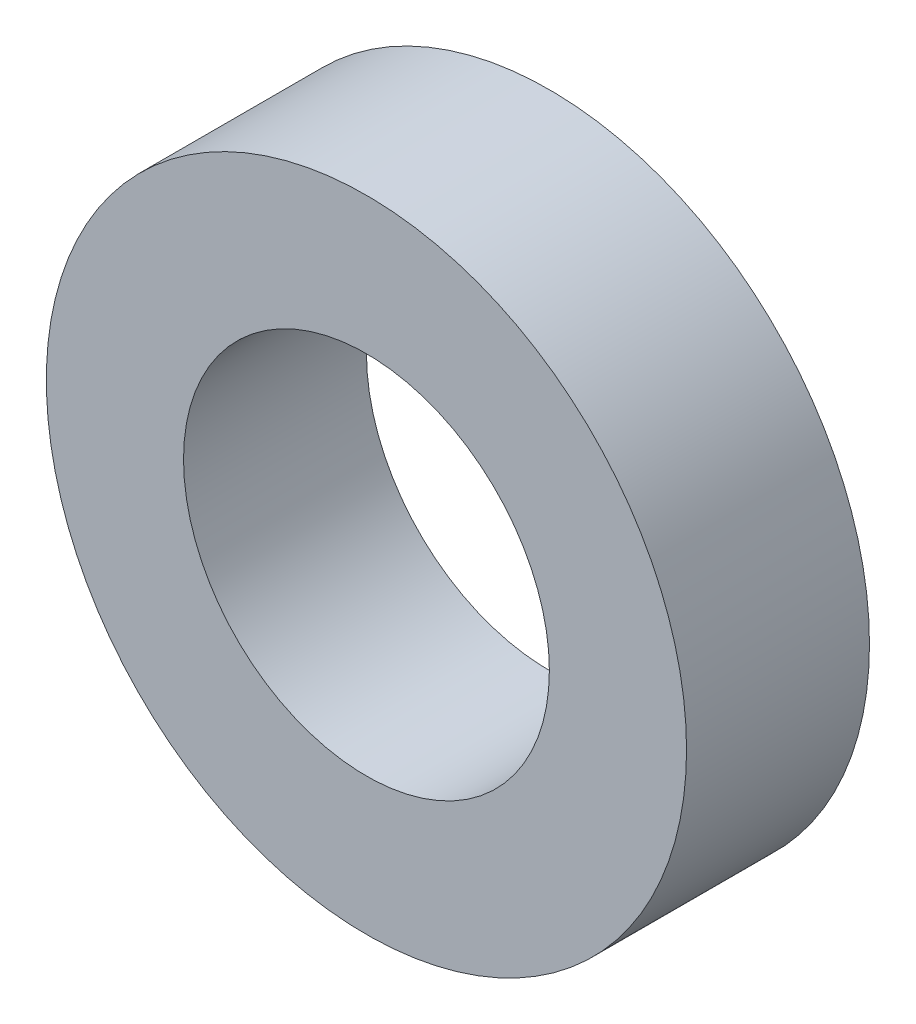
ISO-10303-21;
HEADER;
FILE_DESCRIPTION(('STEP AP214'),'2;1');
FILE_NAME('part.step','',(''),(''),'','','');
FILE_SCHEMA(('AUTOMOTIVE_DESIGN { 1 0 10303 214 1 1 1 1 }'));
ENDSEC;
DATA;
#1=APPLICATION_CONTEXT('core data for automotive mechanical design processes');
#2=APPLICATION_PROTOCOL_DEFINITION('international standard','automotive_design',2000,#1);
#3=PRODUCT_CONTEXT('',#1,'mechanical');
#4=PRODUCT('Part','Part','',(#3));
#5=PRODUCT_RELATED_PRODUCT_CATEGORY('part','',(#4));
#6=PRODUCT_DEFINITION_FORMATION('','',#4);
#7=PRODUCT_DEFINITION_CONTEXT('part definition',#1,'design');
#8=PRODUCT_DEFINITION('design','',#6,#7);
#9=PRODUCT_DEFINITION_SHAPE('','',#8);
#10=(LENGTH_UNIT() NAMED_UNIT(*) SI_UNIT(.MILLI.,.METRE.));
#11=(NAMED_UNIT(*) PLANE_ANGLE_UNIT() SI_UNIT($,.RADIAN.));
#12=(NAMED_UNIT(*) SI_UNIT($,.STERADIAN.) SOLID_ANGLE_UNIT());
#13=UNCERTAINTY_MEASURE_WITH_UNIT(LENGTH_MEASURE(1.E-05),#10,'distance_accuracy_value','');
#14=(GEOMETRIC_REPRESENTATION_CONTEXT(3) GLOBAL_UNCERTAINTY_ASSIGNED_CONTEXT((#13)) GLOBAL_UNIT_ASSIGNED_CONTEXT((#10,
#11,#12)) REPRESENTATION_CONTEXT('',''));
#15=CARTESIAN_POINT('',(0.,0.,0.));
#16=DIRECTION('',(0.,0.,1.));
#17=DIRECTION('',(1.,0.,0.));
#18=AXIS2_PLACEMENT_3D('',#15,#16,#17);
#19=CARTESIAN_POINT('',(0.,0.,10.));
#20=DIRECTION('',(0.,0.,1.));
#21=DIRECTION('',(1.,0.,0.));
#22=AXIS2_PLACEMENT_3D('',#19,#20,#21);
#23=PLANE('',#22);
#24=CARTESIAN_POINT('',(0.,0.,10.));
#25=DIRECTION('',(0.,0.,1.));
#26=DIRECTION('',(1.,0.,0.));
#27=AXIS2_PLACEMENT_3D('',#24,#25,#26);
#28=CIRCLE('',#27,17.5);
#29=CARTESIAN_POINT('',(17.5,0.,10.));
#30=VERTEX_POINT('',#29);
#31=EDGE_CURVE('E10',#30,#30,#28,.T.);
#32=ORIENTED_EDGE('',*,*,#31,.T.);
#33=EDGE_LOOP('',(#32));
#34=FACE_BOUND('',#33,.T.);
#35=CARTESIAN_POINT('',(0.,0.,10.));
#36=DIRECTION('',(0.,0.,1.));
#37=DIRECTION('',(1.,0.,0.));
#38=AXIS2_PLACEMENT_3D('',#35,#36,#37);
#39=CIRCLE('',#38,10.);
#40=CARTESIAN_POINT('',(10.,0.,10.));
#41=VERTEX_POINT('',#40);
#42=EDGE_CURVE('E44',#41,#41,#39,.T.);
#43=ORIENTED_EDGE('',*,*,#42,.F.);
#44=EDGE_LOOP('',(#43));
#45=FACE_BOUND('',#44,.T.);
#46=ADVANCED_FACE('F33',(#34,#45),#23,.T.);
#47=CARTESIAN_POINT('',(0.,0.,0.));
#48=DIRECTION('',(0.,0.,1.));
#49=DIRECTION('',(1.,0.,0.));
#50=AXIS2_PLACEMENT_3D('',#47,#48,#49);
#51=PLANE('',#50);
#52=CARTESIAN_POINT('',(0.,0.,0.));
#53=DIRECTION('',(0.,0.,1.));
#54=DIRECTION('',(1.,0.,0.));
#55=AXIS2_PLACEMENT_3D('',#52,#53,#54);
#56=CIRCLE('',#55,17.5);
#57=CARTESIAN_POINT('',(17.5,0.,0.));
#58=VERTEX_POINT('',#57);
#59=EDGE_CURVE('E37',#58,#58,#56,.T.);
#60=ORIENTED_EDGE('',*,*,#59,.F.);
#61=EDGE_LOOP('',(#60));
#62=FACE_BOUND('',#61,.T.);
#63=CARTESIAN_POINT('',(0.,0.,0.));
#64=DIRECTION('',(0.,0.,1.));
#65=DIRECTION('',(1.,0.,0.));
#66=AXIS2_PLACEMENT_3D('',#63,#64,#65);
#67=CIRCLE('',#66,10.);
#68=CARTESIAN_POINT('',(10.,0.,0.));
#69=VERTEX_POINT('',#68);
#70=EDGE_CURVE('E46',#69,#69,#67,.T.);
#71=ORIENTED_EDGE('',*,*,#70,.T.);
#72=EDGE_LOOP('',(#71));
#73=FACE_BOUND('',#72,.T.);
#74=ADVANCED_FACE('F56',(#62,#73),#51,.F.);
#75=CARTESIAN_POINT('',(0.,0.,10.));
#76=DIRECTION('',(0.,0.,-1.));
#77=DIRECTION('',(-1.,0.,0.));
#78=AXIS2_PLACEMENT_3D('',#75,#76,#77);
#79=CYLINDRICAL_SURFACE('',#78,17.5);
#80=ORIENTED_EDGE('',*,*,#31,.F.);
#81=EDGE_LOOP('',(#80));
#82=FACE_BOUND('',#81,.T.);
#83=ORIENTED_EDGE('',*,*,#59,.T.);
#84=EDGE_LOOP('',(#83));
#85=FACE_BOUND('',#84,.T.);
#86=ADVANCED_FACE('F35',(#82,#85),#79,.T.);
#87=CARTESIAN_POINT('',(0.,0.,10.));
#88=DIRECTION('',(0.,0.,-1.));
#89=DIRECTION('',(-1.,0.,0.));
#90=AXIS2_PLACEMENT_3D('',#87,#88,#89);
#91=CYLINDRICAL_SURFACE('',#90,10.);
#92=ORIENTED_EDGE('',*,*,#42,.T.);
#93=EDGE_LOOP('',(#92));
#94=FACE_BOUND('',#93,.T.);
#95=ORIENTED_EDGE('',*,*,#70,.F.);
#96=EDGE_LOOP('',(#95));
#97=FACE_BOUND('',#96,.T.);
#98=ADVANCED_FACE('F52',(#94,#97),#91,.F.);
#99=CLOSED_SHELL('',(#46,#74,#86,#98));
#100=MANIFOLD_SOLID_BREP('B2',#99);
#101=ADVANCED_BREP_SHAPE_REPRESENTATION('',(#18,#100),#14);
#102=SHAPE_DEFINITION_REPRESENTATION(#9,#101);
ENDSEC;
END-ISO-10303-21;
